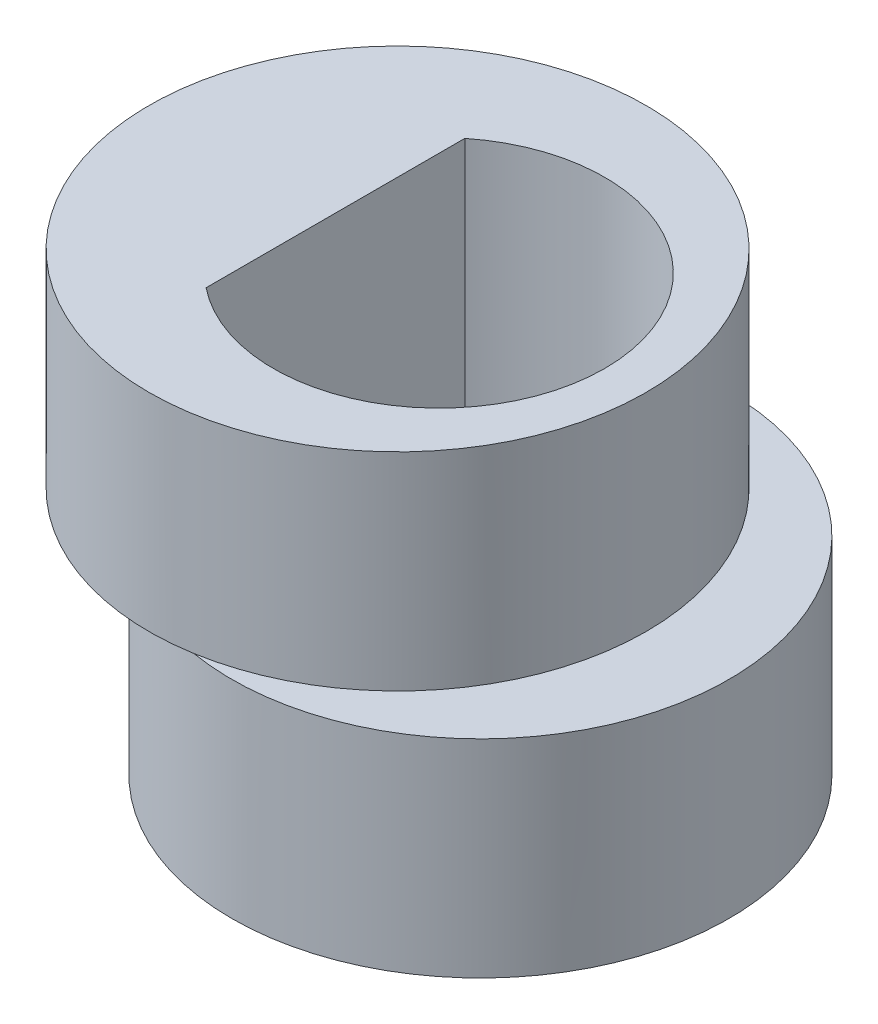
ISO-10303-21;
HEADER;
FILE_DESCRIPTION(('STEP AP214'),'2;1');
FILE_NAME('part.step','',(''),(''),'','','');
FILE_SCHEMA(('AUTOMOTIVE_DESIGN { 1 0 10303 214 1 1 1 1 }'));
ENDSEC;
DATA;
#1=APPLICATION_CONTEXT('core data for automotive mechanical design processes');
#2=APPLICATION_PROTOCOL_DEFINITION('international standard','automotive_design',2000,#1);
#3=PRODUCT_CONTEXT('',#1,'mechanical');
#4=PRODUCT('Part','Part','',(#3));
#5=PRODUCT_RELATED_PRODUCT_CATEGORY('part','',(#4));
#6=PRODUCT_DEFINITION_FORMATION('','',#4);
#7=PRODUCT_DEFINITION_CONTEXT('part definition',#1,'design');
#8=PRODUCT_DEFINITION('design','',#6,#7);
#9=PRODUCT_DEFINITION_SHAPE('','',#8);
#10=(LENGTH_UNIT() NAMED_UNIT(*) SI_UNIT(.MILLI.,.METRE.));
#11=(NAMED_UNIT(*) PLANE_ANGLE_UNIT() SI_UNIT($,.RADIAN.));
#12=(NAMED_UNIT(*) SI_UNIT($,.STERADIAN.) SOLID_ANGLE_UNIT());
#13=UNCERTAINTY_MEASURE_WITH_UNIT(LENGTH_MEASURE(1.E-05),#10,'distance_accuracy_value','');
#14=(GEOMETRIC_REPRESENTATION_CONTEXT(3) GLOBAL_UNCERTAINTY_ASSIGNED_CONTEXT((#13)) GLOBAL_UNIT_ASSIGNED_CONTEXT((#10,
#11,#12)) REPRESENTATION_CONTEXT('',''));
#15=CARTESIAN_POINT('',(0.,0.,0.));
#16=DIRECTION('',(0.,0.,1.));
#17=DIRECTION('',(1.,0.,0.));
#18=AXIS2_PLACEMENT_3D('',#15,#16,#17);
#19=CARTESIAN_POINT('',(0.,5.,0.));
#20=DIRECTION('',(0.,-1.,0.));
#21=DIRECTION('',(0.,0.,-1.));
#22=AXIS2_PLACEMENT_3D('',#19,#20,#21);
#23=CYLINDRICAL_SURFACE('',#22,4.);
#24=CARTESIAN_POINT('',(0.,10.,0.));
#25=DIRECTION('',(0.,1.,0.));
#26=DIRECTION('',(0.,0.,1.));
#27=AXIS2_PLACEMENT_3D('',#24,#25,#26);
#28=CIRCLE('',#27,4.);
#29=CARTESIAN_POINT('',(-2.5,10.,3.1224989991992));
#30=VERTEX_POINT('',#29);
#31=CARTESIAN_POINT('',(-2.5,10.,-3.1224989991992));
#32=VERTEX_POINT('',#31);
#33=EDGE_CURVE('E68',#30,#32,#28,.T.);
#34=ORIENTED_EDGE('',*,*,#33,.T.);
#35=DIRECTION('',(0.,-1.,0.));
#36=VECTOR('',#35,1.);
#37=CARTESIAN_POINT('',(-2.5,10.,-3.1224989991992));
#38=LINE('',#37,#36);
#39=CARTESIAN_POINT('',(-2.5,0.,-3.1224989991992));
#40=VERTEX_POINT('',#39);
#41=EDGE_CURVE('E55',#32,#40,#38,.T.);
#42=ORIENTED_EDGE('',*,*,#41,.T.);
#43=CARTESIAN_POINT('',(0.,0.,0.));
#44=DIRECTION('',(0.,1.,0.));
#45=DIRECTION('',(0.,0.,1.));
#46=AXIS2_PLACEMENT_3D('',#43,#44,#45);
#47=CIRCLE('',#46,4.);
#48=CARTESIAN_POINT('',(-2.5,0.,3.1224989991992));
#49=VERTEX_POINT('',#48);
#50=EDGE_CURVE('E50',#49,#40,#47,.T.);
#51=ORIENTED_EDGE('',*,*,#50,.F.);
#52=DIRECTION('',(0.,-1.,0.));
#53=VECTOR('',#52,1.);
#54=CARTESIAN_POINT('',(-2.5,10.,3.1224989991992));
#55=LINE('',#54,#53);
#56=EDGE_CURVE('E73',#30,#49,#55,.T.);
#57=ORIENTED_EDGE('',*,*,#56,.F.);
#58=EDGE_LOOP('',(#34,#42,#51,#57));
#59=FACE_BOUND('',#58,.T.);
#60=ADVANCED_FACE('F34',(#59),#23,.F.);
#61=CARTESIAN_POINT('',(1.,5.,0.));
#62=DIRECTION('',(0.,1.,0.));
#63=DIRECTION('',(0.,0.,1.));
#64=AXIS2_PLACEMENT_3D('',#61,#62,#63);
#65=PLANE('',#64);
#66=CARTESIAN_POINT('',(-1.,5.,0.));
#67=DIRECTION('',(0.,1.,0.));
#68=DIRECTION('',(0.,0.,1.));
#69=AXIS2_PLACEMENT_3D('',#66,#67,#68);
#70=CIRCLE('',#69,6.);
#71=CARTESIAN_POINT('',(0.,5.,5.91607978309962));
#72=VERTEX_POINT('',#71);
#73=CARTESIAN_POINT('',(0.,5.,-5.91607978309962));
#74=VERTEX_POINT('',#73);
#75=EDGE_CURVE('E88',#72,#74,#70,.T.);
#76=ORIENTED_EDGE('',*,*,#75,.F.);
#77=CARTESIAN_POINT('',(1.,5.,0.));
#78=DIRECTION('',(0.,1.,0.));
#79=DIRECTION('',(0.,0.,1.));
#80=AXIS2_PLACEMENT_3D('',#77,#78,#79);
#81=CIRCLE('',#80,6.);
#82=EDGE_CURVE('E43',#72,#74,#81,.T.);
#83=ORIENTED_EDGE('',*,*,#82,.T.);
#84=EDGE_LOOP('',(#76,#83));
#85=FACE_BOUND('',#84,.T.);
#86=ADVANCED_FACE('F99',(#85),#65,.T.);
#87=CARTESIAN_POINT('',(1.,0.,0.));
#88=DIRECTION('',(0.,1.,0.));
#89=DIRECTION('',(0.,0.,1.));
#90=AXIS2_PLACEMENT_3D('',#87,#88,#89);
#91=PLANE('',#90);
#92=CARTESIAN_POINT('',(1.,0.,0.));
#93=DIRECTION('',(0.,1.,0.));
#94=DIRECTION('',(0.,0.,1.));
#95=AXIS2_PLACEMENT_3D('',#92,#93,#94);
#96=CIRCLE('',#95,6.);
#97=CARTESIAN_POINT('',(1.,0.,6.));
#98=VERTEX_POINT('',#97);
#99=EDGE_CURVE('E38',#98,#98,#96,.T.);
#100=ORIENTED_EDGE('',*,*,#99,.F.);
#101=EDGE_LOOP('',(#100));
#102=FACE_BOUND('',#101,.T.);
#103=ORIENTED_EDGE('',*,*,#50,.T.);
#104=DIRECTION('',(0.,0.,-1.));
#105=VECTOR('',#104,1.);
#106=CARTESIAN_POINT('',(-2.5,0.,-3.1224989991992));
#107=LINE('',#106,#105);
#108=EDGE_CURVE('E80',#49,#40,#107,.T.);
#109=ORIENTED_EDGE('',*,*,#108,.F.);
#110=EDGE_LOOP('',(#103,#109));
#111=FACE_BOUND('',#110,.T.);
#112=ADVANCED_FACE('F123',(#102,#111),#91,.F.);
#113=CARTESIAN_POINT('',(1.,5.,0.));
#114=DIRECTION('',(0.,-1.,0.));
#115=DIRECTION('',(0.,0.,-1.));
#116=AXIS2_PLACEMENT_3D('',#113,#114,#115);
#117=CYLINDRICAL_SURFACE('',#116,6.);
#118=EDGE_CURVE('E11',#74,#72,#81,.T.);
#119=ORIENTED_EDGE('',*,*,#118,.F.);
#120=ORIENTED_EDGE('',*,*,#82,.F.);
#121=EDGE_LOOP('',(#119,#120));
#122=FACE_BOUND('',#121,.T.);
#123=ORIENTED_EDGE('',*,*,#99,.T.);
#124=EDGE_LOOP('',(#123));
#125=FACE_BOUND('',#124,.T.);
#126=ADVANCED_FACE('F36',(#122,#125),#117,.T.);
#127=CARTESIAN_POINT('',(-1.,5.,0.));
#128=DIRECTION('',(0.,1.,0.));
#129=DIRECTION('',(0.,0.,1.));
#130=AXIS2_PLACEMENT_3D('',#127,#128,#129);
#131=PLANE('',#130);
#132=EDGE_CURVE('E72',#74,#72,#70,.T.);
#133=ORIENTED_EDGE('',*,*,#132,.F.);
#134=ORIENTED_EDGE('',*,*,#118,.T.);
#135=EDGE_LOOP('',(#133,#134));
#136=FACE_BOUND('',#135,.T.);
#137=ADVANCED_FACE('F103',(#136),#131,.F.);
#138=CARTESIAN_POINT('',(-1.,10.,0.));
#139=DIRECTION('',(0.,1.,0.));
#140=DIRECTION('',(0.,0.,1.));
#141=AXIS2_PLACEMENT_3D('',#138,#139,#140);
#142=PLANE('',#141);
#143=CARTESIAN_POINT('',(-1.,10.,0.));
#144=DIRECTION('',(0.,1.,0.));
#145=DIRECTION('',(0.,0.,1.));
#146=AXIS2_PLACEMENT_3D('',#143,#144,#145);
#147=CIRCLE('',#146,6.);
#148=CARTESIAN_POINT('',(-1.,10.,6.));
#149=VERTEX_POINT('',#148);
#150=EDGE_CURVE('E85',#149,#149,#147,.T.);
#151=ORIENTED_EDGE('',*,*,#150,.T.);
#152=EDGE_LOOP('',(#151));
#153=FACE_BOUND('',#152,.T.);
#154=ORIENTED_EDGE('',*,*,#33,.F.);
#155=DIRECTION('',(0.,0.,-1.));
#156=VECTOR('',#155,1.);
#157=CARTESIAN_POINT('',(-2.5,10.,-3.1224989991992));
#158=LINE('',#157,#156);
#159=EDGE_CURVE('E71',#30,#32,#158,.T.);
#160=ORIENTED_EDGE('',*,*,#159,.T.);
#161=EDGE_LOOP('',(#154,#160));
#162=FACE_BOUND('',#161,.T.);
#163=ADVANCED_FACE('F69',(#153,#162),#142,.T.);
#164=CARTESIAN_POINT('',(-1.,10.,0.));
#165=DIRECTION('',(0.,-1.,0.));
#166=DIRECTION('',(0.,0.,-1.));
#167=AXIS2_PLACEMENT_3D('',#164,#165,#166);
#168=CYLINDRICAL_SURFACE('',#167,6.);
#169=ORIENTED_EDGE('',*,*,#150,.F.);
#170=EDGE_LOOP('',(#169));
#171=FACE_BOUND('',#170,.T.);
#172=ORIENTED_EDGE('',*,*,#75,.T.);
#173=ORIENTED_EDGE('',*,*,#132,.T.);
#174=EDGE_LOOP('',(#172,#173));
#175=FACE_BOUND('',#174,.T.);
#176=ADVANCED_FACE('F105',(#171,#175),#168,.T.);
#177=CARTESIAN_POINT('',(-2.5,10.,-3.1224989991992));
#178=DIRECTION('',(-1.,0.,0.));
#179=DIRECTION('',(0.,0.,1.));
#180=AXIS2_PLACEMENT_3D('',#177,#178,#179);
#181=PLANE('',#180);
#182=ORIENTED_EDGE('',*,*,#108,.T.);
#183=ORIENTED_EDGE('',*,*,#41,.F.);
#184=ORIENTED_EDGE('',*,*,#159,.F.);
#185=ORIENTED_EDGE('',*,*,#56,.T.);
#186=EDGE_LOOP('',(#182,#183,#184,#185));
#187=FACE_BOUND('',#186,.T.);
#188=ADVANCED_FACE('F79',(#187),#181,.F.);
#189=CLOSED_SHELL('',(#60,#86,#112,#126,#137,#163,#176,#188));
#190=MANIFOLD_SOLID_BREP('B2',#189);
#191=ADVANCED_BREP_SHAPE_REPRESENTATION('',(#18,#190),#14);
#192=SHAPE_DEFINITION_REPRESENTATION(#9,#191);
ENDSEC;
END-ISO-10303-21;
